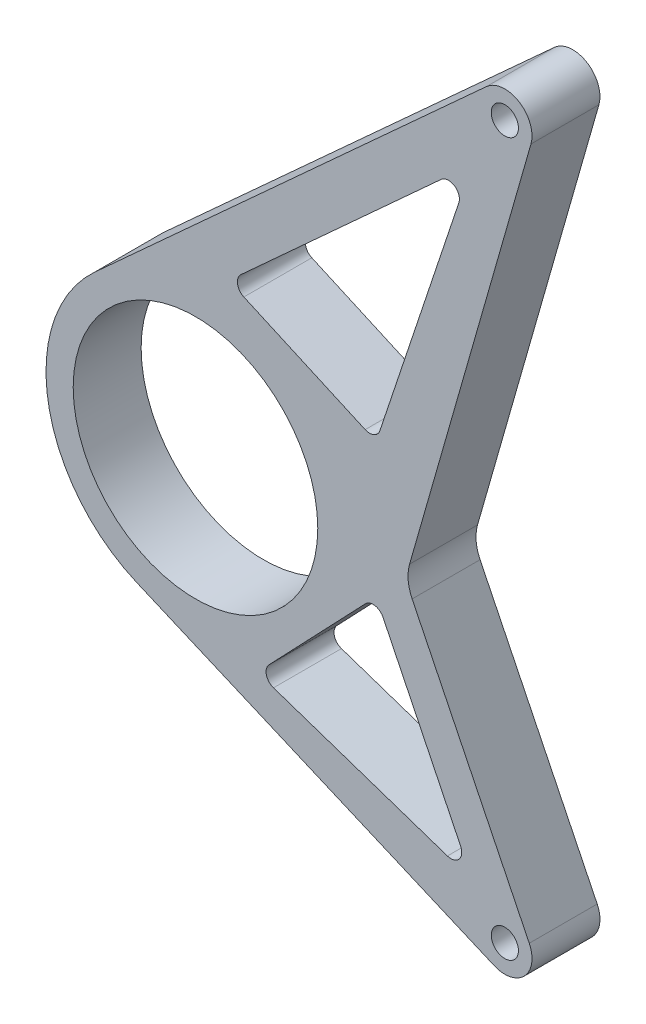
ISO-10303-21;
HEADER;
FILE_DESCRIPTION(('STEP AP214'),'2;1');
FILE_NAME('part.step','',(''),(''),'','','');
FILE_SCHEMA(('AUTOMOTIVE_DESIGN { 1 0 10303 214 1 1 1 1 }'));
ENDSEC;
DATA;
#1=APPLICATION_CONTEXT('core data for automotive mechanical design processes');
#2=APPLICATION_PROTOCOL_DEFINITION('international standard','automotive_design',2000,#1);
#3=PRODUCT_CONTEXT('',#1,'mechanical');
#4=PRODUCT('Part','Part','',(#3));
#5=PRODUCT_RELATED_PRODUCT_CATEGORY('part','',(#4));
#6=PRODUCT_DEFINITION_FORMATION('','',#4);
#7=PRODUCT_DEFINITION_CONTEXT('part definition',#1,'design');
#8=PRODUCT_DEFINITION('design','',#6,#7);
#9=PRODUCT_DEFINITION_SHAPE('','',#8);
#10=(LENGTH_UNIT() NAMED_UNIT(*) SI_UNIT(.MILLI.,.METRE.));
#11=(NAMED_UNIT(*) PLANE_ANGLE_UNIT() SI_UNIT($,.RADIAN.));
#12=(NAMED_UNIT(*) SI_UNIT($,.STERADIAN.) SOLID_ANGLE_UNIT());
#13=UNCERTAINTY_MEASURE_WITH_UNIT(LENGTH_MEASURE(1.E-05),#10,'distance_accuracy_value','');
#14=(GEOMETRIC_REPRESENTATION_CONTEXT(3) GLOBAL_UNCERTAINTY_ASSIGNED_CONTEXT((#13)) GLOBAL_UNIT_ASSIGNED_CONTEXT((#10,
#11,#12)) REPRESENTATION_CONTEXT('',''));
#15=CARTESIAN_POINT('',(0.,0.,0.));
#16=DIRECTION('',(0.,0.,1.));
#17=DIRECTION('',(1.,0.,0.));
#18=AXIS2_PLACEMENT_3D('',#15,#16,#17);
#19=CARTESIAN_POINT('',(62.322121242482,30.4626489139366,25.));
#20=DIRECTION('',(-0.89841816686152,-0.439140976741167,0.));
#21=DIRECTION('',(0.439140976741167,-0.89841816686152,0.));
#22=AXIS2_PLACEMENT_3D('',#19,#20,#21);
#23=PLANE('',#22);
#24=DIRECTION('',(-0.439140976741167,0.89841816686152,0.));
#25=VECTOR('',#24,1.);
#26=CARTESIAN_POINT('',(62.322121242482,30.4626489139366,0.));
#27=LINE('',#26,#25);
#28=CARTESIAN_POINT('',(122.814256533455,-93.2954064170916,0.));
#29=VERTEX_POINT('',#28);
#30=CARTESIAN_POINT('',(79.7177248539004,-5.12621009894399,0.));
#31=VERTEX_POINT('',#30);
#32=EDGE_CURVE('E349',#29,#31,#27,.T.);
#33=ORIENTED_EDGE('',*,*,#32,.T.);
#34=DIRECTION('',(0.,0.,-1.));
#35=VECTOR('',#34,1.);
#36=CARTESIAN_POINT('',(79.7177248539004,-5.12621009894399,25.));
#37=LINE('',#36,#35);
#38=CARTESIAN_POINT('',(79.7177248539004,-5.12621009894399,25.));
#39=VERTEX_POINT('',#38);
#40=EDGE_CURVE('E11',#39,#31,#37,.T.);
#41=ORIENTED_EDGE('',*,*,#40,.F.);
#42=DIRECTION('',(-0.439140976741167,0.89841816686152,0.));
#43=VECTOR('',#42,1.);
#44=CARTESIAN_POINT('',(62.322121242482,30.4626489139366,25.));
#45=LINE('',#44,#43);
#46=CARTESIAN_POINT('',(122.814256533455,-93.2954064170916,25.));
#47=VERTEX_POINT('',#46);
#48=EDGE_CURVE('E311',#47,#39,#45,.T.);
#49=ORIENTED_EDGE('',*,*,#48,.F.);
#50=DIRECTION('',(0.,0.,-1.));
#51=VECTOR('',#50,1.);
#52=CARTESIAN_POINT('',(122.814256533455,-93.2954064170916,25.));
#53=LINE('',#52,#51);
#54=EDGE_CURVE('E337',#47,#29,#53,.T.);
#55=ORIENTED_EDGE('',*,*,#54,.T.);
#56=EDGE_LOOP('',(#33,#41,#49,#55));
#57=FACE_BOUND('',#56,.T.);
#58=ADVANCED_FACE('F41',(#57),#23,.F.);
#59=CARTESIAN_POINT('',(93.0700707771078,1.40033004325586,25.));
#60=DIRECTION('',(0.,0.,-1.));
#61=DIRECTION('',(-1.,0.,0.));
#62=AXIS2_PLACEMENT_3D('',#59,#60,#61);
#63=CYLINDRICAL_SURFACE('',#62,14.862061360415);
#64=CARTESIAN_POINT('',(93.0700707771078,1.40033004325586,0.));
#65=DIRECTION('',(0.,0.,1.));
#66=DIRECTION('',(1.,0.,0.));
#67=AXIS2_PLACEMENT_3D('',#64,#65,#66);
#68=CIRCLE('',#67,14.862061360415);
#69=CARTESIAN_POINT('',(78.7806227117508,5.48598077088858,0.));
#70=VERTEX_POINT('',#69);
#71=EDGE_CURVE('E353',#31,#70,#68,.F.);
#72=ORIENTED_EDGE('',*,*,#71,.T.);
#73=DIRECTION('',(0.,0.,-1.));
#74=VECTOR('',#73,1.);
#75=CARTESIAN_POINT('',(78.7806227117508,5.48598077088858,25.));
#76=LINE('',#75,#74);
#77=CARTESIAN_POINT('',(78.7806227117508,5.48598077088858,25.));
#78=VERTEX_POINT('',#77);
#79=EDGE_CURVE('E50',#78,#70,#76,.T.);
#80=ORIENTED_EDGE('',*,*,#79,.F.);
#81=CARTESIAN_POINT('',(93.0700707771078,1.40033004325586,25.));
#82=DIRECTION('',(0.,0.,1.));
#83=DIRECTION('',(1.,0.,0.));
#84=AXIS2_PLACEMENT_3D('',#81,#82,#83);
#85=CIRCLE('',#84,14.862061360415);
#86=EDGE_CURVE('E315',#39,#78,#85,.F.);
#87=ORIENTED_EDGE('',*,*,#86,.F.);
#88=ORIENTED_EDGE('',*,*,#40,.T.);
#89=EDGE_LOOP('',(#72,#80,#87,#88));
#90=FACE_BOUND('',#89,.T.);
#91=ADVANCED_FACE('F418',(#90),#63,.F.);
#92=CARTESIAN_POINT('',(71.3769498235631,-20.4081561197483,25.));
#93=DIRECTION('',(-0.9614714755126,0.274904713993092,0.));
#94=DIRECTION('',(-0.274904713993092,-0.9614714755126,0.));
#95=AXIS2_PLACEMENT_3D('',#92,#93,#94);
#96=PLANE('',#95);
#97=DIRECTION('',(0.274904713993092,0.9614714755126,0.));
#98=VECTOR('',#97,1.);
#99=CARTESIAN_POINT('',(71.3769498235631,-20.4081561197483,0.));
#100=LINE('',#99,#98);
#101=CARTESIAN_POINT('',(123.444789619966,161.69764348127,0.));
#102=VERTEX_POINT('',#101);
#103=EDGE_CURVE('E356',#70,#102,#100,.T.);
#104=ORIENTED_EDGE('',*,*,#103,.T.);
#105=DIRECTION('',(0.,0.,-1.));
#106=VECTOR('',#105,1.);
#107=CARTESIAN_POINT('',(123.444789619966,161.69764348127,25.));
#108=LINE('',#107,#106);
#109=CARTESIAN_POINT('',(123.444789619966,161.69764348127,25.));
#110=VERTEX_POINT('',#109);
#111=EDGE_CURVE('E392',#110,#102,#108,.T.);
#112=ORIENTED_EDGE('',*,*,#111,.F.);
#113=DIRECTION('',(0.274904713993092,0.9614714755126,0.));
#114=VECTOR('',#113,1.);
#115=CARTESIAN_POINT('',(71.3769498235631,-20.4081561197483,25.));
#116=LINE('',#115,#114);
#117=EDGE_CURVE('E318',#78,#110,#116,.T.);
#118=ORIENTED_EDGE('',*,*,#117,.F.);
#119=ORIENTED_EDGE('',*,*,#79,.T.);
#120=EDGE_LOOP('',(#104,#112,#118,#119));
#121=FACE_BOUND('',#120,.T.);
#122=ADVANCED_FACE('F401',(#121),#96,.F.);
#123=CARTESIAN_POINT('',(113.83007486484,164.446690621201,25.));
#124=DIRECTION('',(0.,0.,-1.));
#125=DIRECTION('',(-1.,0.,0.));
#126=AXIS2_PLACEMENT_3D('',#123,#124,#125);
#127=CYLINDRICAL_SURFACE('',#126,10.);
#128=CARTESIAN_POINT('',(113.83007486484,164.446690621201,0.));
#129=DIRECTION('',(0.,0.,1.));
#130=DIRECTION('',(1.,0.,0.));
#131=AXIS2_PLACEMENT_3D('',#128,#129,#130);
#132=CIRCLE('',#131,10.);
#133=CARTESIAN_POINT('',(107.099159500341,171.842282440383,0.));
#134=VERTEX_POINT('',#133);
#135=EDGE_CURVE('E359',#102,#134,#132,.T.);
#136=ORIENTED_EDGE('',*,*,#135,.T.);
#137=DIRECTION('',(0.,0.,-1.));
#138=VECTOR('',#137,1.);
#139=CARTESIAN_POINT('',(107.099159500341,171.842282440383,25.));
#140=LINE('',#139,#138);
#141=CARTESIAN_POINT('',(107.099159500341,171.842282440383,25.));
#142=VERTEX_POINT('',#141);
#143=EDGE_CURVE('E389',#142,#134,#140,.T.);
#144=ORIENTED_EDGE('',*,*,#143,.F.);
#145=CARTESIAN_POINT('',(113.83007486484,164.446690621201,25.));
#146=DIRECTION('',(0.,0.,1.));
#147=DIRECTION('',(1.,0.,0.));
#148=AXIS2_PLACEMENT_3D('',#145,#146,#147);
#149=CIRCLE('',#148,10.);
#150=EDGE_CURVE('E321',#110,#142,#149,.T.);
#151=ORIENTED_EDGE('',*,*,#150,.F.);
#152=ORIENTED_EDGE('',*,*,#111,.T.);
#153=EDGE_LOOP('',(#136,#144,#151,#152));
#154=FACE_BOUND('',#153,.T.);
#155=ADVANCED_FACE('F412',(#154),#127,.T.);
#156=CARTESIAN_POINT('',(-37.020034504742,40.6757550055031,25.));
#157=DIRECTION('',(-0.673091536449854,0.739559181918239,0.));
#158=DIRECTION('',(-0.739559181918239,-0.673091536449854,0.));
#159=AXIS2_PLACEMENT_3D('',#156,#157,#158);
#160=PLANE('',#159);
#161=DIRECTION('',(0.739559181918239,0.673091536449854,0.));
#162=VECTOR('',#161,1.);
#163=CARTESIAN_POINT('',(-37.020034504742,40.6757550055031,0.));
#164=LINE('',#163,#162);
#165=CARTESIAN_POINT('',(-37.020034504742,40.6757550055031,0.));
#166=VERTEX_POINT('',#165);
#167=EDGE_CURVE('E363',#166,#134,#164,.T.);
#168=ORIENTED_EDGE('',*,*,#167,.F.);
#169=DIRECTION('',(0.,0.,-1.));
#170=VECTOR('',#169,1.);
#171=CARTESIAN_POINT('',(-37.020034504742,40.6757550055031,25.));
#172=LINE('',#171,#170);
#173=CARTESIAN_POINT('',(-37.020034504742,40.6757550055031,25.));
#174=VERTEX_POINT('',#173);
#175=EDGE_CURVE('E386',#174,#166,#172,.T.);
#176=ORIENTED_EDGE('',*,*,#175,.F.);
#177=DIRECTION('',(0.739559181918239,0.673091536449854,0.));
#178=VECTOR('',#177,1.);
#179=CARTESIAN_POINT('',(-37.020034504742,40.6757550055031,25.));
#180=LINE('',#179,#178);
#181=EDGE_CURVE('E324',#174,#142,#180,.T.);
#182=ORIENTED_EDGE('',*,*,#181,.T.);
#183=ORIENTED_EDGE('',*,*,#143,.T.);
#184=EDGE_LOOP('',(#168,#176,#182,#183));
#185=FACE_BOUND('',#184,.T.);
#186=ADVANCED_FACE('F435',(#185),#160,.T.);
#187=CARTESIAN_POINT('',(0.,0.,25.));
#188=DIRECTION('',(0.,0.,-1.));
#189=DIRECTION('',(-1.,0.,0.));
#190=AXIS2_PLACEMENT_3D('',#187,#188,#189);
#191=CYLINDRICAL_SURFACE('',#190,55.);
#192=CARTESIAN_POINT('',(0.,0.,0.));
#193=DIRECTION('',(0.,0.,1.));
#194=DIRECTION('',(1.,0.,0.));
#195=AXIS2_PLACEMENT_3D('',#192,#193,#194);
#196=CIRCLE('',#195,55.);
#197=CARTESIAN_POINT('',(-21.6473623522042,-50.5607723753541,0.));
#198=VERTEX_POINT('',#197);
#199=EDGE_CURVE('E367',#166,#198,#196,.T.);
#200=ORIENTED_EDGE('',*,*,#199,.T.);
#201=DIRECTION('',(0.,0.,-1.));
#202=VECTOR('',#201,1.);
#203=CARTESIAN_POINT('',(-21.6473623522042,-50.5607723753541,25.));
#204=LINE('',#203,#202);
#205=CARTESIAN_POINT('',(-21.6473623522042,-50.5607723753541,25.));
#206=VERTEX_POINT('',#205);
#207=EDGE_CURVE('E382',#206,#198,#204,.T.);
#208=ORIENTED_EDGE('',*,*,#207,.F.);
#209=CARTESIAN_POINT('',(0.,0.,25.));
#210=DIRECTION('',(0.,0.,1.));
#211=DIRECTION('',(1.,0.,0.));
#212=AXIS2_PLACEMENT_3D('',#209,#210,#211);
#213=CIRCLE('',#212,55.);
#214=EDGE_CURVE('E328',#174,#206,#213,.T.);
#215=ORIENTED_EDGE('',*,*,#214,.F.);
#216=ORIENTED_EDGE('',*,*,#175,.T.);
#217=EDGE_LOOP('',(#200,#208,#215,#216));
#218=FACE_BOUND('',#217,.T.);
#219=ADVANCED_FACE('F433',(#218),#191,.T.);
#220=CARTESIAN_POINT('',(-21.6473623522042,-50.5607723753541,25.));
#221=DIRECTION('',(0.393588406403713,0.919286770460984,0.));
#222=DIRECTION('',(-0.919286770460984,0.393588406403713,0.));
#223=AXIS2_PLACEMENT_3D('',#220,#221,#222);
#224=PLANE('',#223);
#225=DIRECTION('',(0.919286770460984,-0.393588406403713,0.));
#226=VECTOR('',#225,1.);
#227=CARTESIAN_POINT('',(-21.6473623522042,-50.5607723753541,0.));
#228=LINE('',#227,#226);
#229=CARTESIAN_POINT('',(109.894190800803,-106.879683889113,0.));
#230=VERTEX_POINT('',#229);
#231=EDGE_CURVE('E370',#198,#230,#228,.T.);
#232=ORIENTED_EDGE('',*,*,#231,.T.);
#233=DIRECTION('',(0.,0.,-1.));
#234=VECTOR('',#233,1.);
#235=CARTESIAN_POINT('',(109.894190800803,-106.879683889113,25.));
#236=LINE('',#235,#234);
#237=CARTESIAN_POINT('',(109.894190800803,-106.879683889113,25.));
#238=VERTEX_POINT('',#237);
#239=EDGE_CURVE('E378',#238,#230,#236,.T.);
#240=ORIENTED_EDGE('',*,*,#239,.F.);
#241=DIRECTION('',(0.919286770460984,-0.393588406403713,0.));
#242=VECTOR('',#241,1.);
#243=CARTESIAN_POINT('',(-21.6473623522042,-50.5607723753541,25.));
#244=LINE('',#243,#242);
#245=EDGE_CURVE('E331',#206,#238,#244,.T.);
#246=ORIENTED_EDGE('',*,*,#245,.F.);
#247=ORIENTED_EDGE('',*,*,#207,.T.);
#248=EDGE_LOOP('',(#232,#240,#246,#247));
#249=FACE_BOUND('',#248,.T.);
#250=ADVANCED_FACE('F429',(#249),#224,.F.);
#251=CARTESIAN_POINT('',(113.83007486484,-97.6868161845032,25.));
#252=DIRECTION('',(0.,0.,-1.));
#253=DIRECTION('',(-1.,0.,0.));
#254=AXIS2_PLACEMENT_3D('',#251,#252,#253);
#255=CYLINDRICAL_SURFACE('',#254,4.99999999999999);
#256=CARTESIAN_POINT('',(113.83007486484,-97.6868161845032,25.));
#257=DIRECTION('',(0.,0.,1.));
#258=DIRECTION('',(1.,0.,0.));
#259=AXIS2_PLACEMENT_3D('',#256,#257,#258);
#260=CIRCLE('',#259,4.99999999999999);
#261=CARTESIAN_POINT('',(118.83007486484,-97.6868161845032,25.));
#262=VERTEX_POINT('',#261);
#263=EDGE_CURVE('E307',#262,#262,#260,.T.);
#264=ORIENTED_EDGE('',*,*,#263,.T.);
#265=EDGE_LOOP('',(#264));
#266=FACE_BOUND('',#265,.T.);
#267=CARTESIAN_POINT('',(113.83007486484,-97.6868161845032,0.));
#268=DIRECTION('',(0.,0.,1.));
#269=DIRECTION('',(1.,0.,0.));
#270=AXIS2_PLACEMENT_3D('',#267,#268,#269);
#271=CIRCLE('',#270,4.99999999999999);
#272=CARTESIAN_POINT('',(118.83007486484,-97.6868161845032,0.));
#273=VERTEX_POINT('',#272);
#274=EDGE_CURVE('E345',#273,#273,#271,.T.);
#275=ORIENTED_EDGE('',*,*,#274,.F.);
#276=EDGE_LOOP('',(#275));
#277=FACE_BOUND('',#276,.T.);
#278=ADVANCED_FACE('F452',(#266,#277),#255,.F.);
#279=CARTESIAN_POINT('',(113.83007486484,164.446690621201,25.));
#280=DIRECTION('',(0.,0.,-1.));
#281=DIRECTION('',(-1.,0.,0.));
#282=AXIS2_PLACEMENT_3D('',#279,#280,#281);
#283=CYLINDRICAL_SURFACE('',#282,4.99999999999999);
#284=CARTESIAN_POINT('',(113.83007486484,164.446690621201,25.));
#285=DIRECTION('',(0.,0.,1.));
#286=DIRECTION('',(1.,0.,0.));
#287=AXIS2_PLACEMENT_3D('',#284,#285,#286);
#288=CIRCLE('',#287,4.99999999999999);
#289=CARTESIAN_POINT('',(118.83007486484,164.446690621201,25.));
#290=VERTEX_POINT('',#289);
#291=EDGE_CURVE('E302',#290,#290,#288,.T.);
#292=ORIENTED_EDGE('',*,*,#291,.T.);
#293=EDGE_LOOP('',(#292));
#294=FACE_BOUND('',#293,.T.);
#295=CARTESIAN_POINT('',(113.83007486484,164.446690621201,0.));
#296=DIRECTION('',(0.,0.,1.));
#297=DIRECTION('',(1.,0.,0.));
#298=AXIS2_PLACEMENT_3D('',#295,#296,#297);
#299=CIRCLE('',#298,4.99999999999999);
#300=CARTESIAN_POINT('',(118.83007486484,164.446690621201,0.));
#301=VERTEX_POINT('',#300);
#302=EDGE_CURVE('E341',#301,#301,#299,.T.);
#303=ORIENTED_EDGE('',*,*,#302,.F.);
#304=EDGE_LOOP('',(#303));
#305=FACE_BOUND('',#304,.T.);
#306=ADVANCED_FACE('F454',(#294,#305),#283,.F.);
#307=CARTESIAN_POINT('',(0.,0.,25.));
#308=DIRECTION('',(0.,0.,-1.));
#309=DIRECTION('',(-1.,0.,0.));
#310=AXIS2_PLACEMENT_3D('',#307,#308,#309);
#311=CYLINDRICAL_SURFACE('',#310,45.);
#312=CARTESIAN_POINT('',(0.,0.,25.));
#313=DIRECTION('',(0.,0.,1.));
#314=DIRECTION('',(1.,0.,0.));
#315=AXIS2_PLACEMENT_3D('',#312,#313,#314);
#316=CIRCLE('',#315,45.);
#317=CARTESIAN_POINT('',(45.,0.,25.));
#318=VERTEX_POINT('',#317);
#319=EDGE_CURVE('E298',#318,#318,#316,.T.);
#320=ORIENTED_EDGE('',*,*,#319,.T.);
#321=EDGE_LOOP('',(#320));
#322=FACE_BOUND('',#321,.T.);
#323=CARTESIAN_POINT('',(0.,0.,0.));
#324=DIRECTION('',(0.,0.,1.));
#325=DIRECTION('',(1.,0.,0.));
#326=AXIS2_PLACEMENT_3D('',#323,#324,#325);
#327=CIRCLE('',#326,45.);
#328=CARTESIAN_POINT('',(45.,0.,0.));
#329=VERTEX_POINT('',#328);
#330=EDGE_CURVE('E237',#329,#329,#327,.T.);
#331=ORIENTED_EDGE('',*,*,#330,.F.);
#332=EDGE_LOOP('',(#331));
#333=FACE_BOUND('',#332,.T.);
#334=ADVANCED_FACE('F43',(#322,#333),#311,.F.);
#335=CARTESIAN_POINT('',(113.83007486484,-97.6868161845032,25.));
#336=DIRECTION('',(0.,0.,-1.));
#337=DIRECTION('',(-1.,0.,0.));
#338=AXIS2_PLACEMENT_3D('',#335,#336,#337);
#339=CYLINDRICAL_SURFACE('',#338,9.99999999999999);
#340=CARTESIAN_POINT('',(113.83007486484,-97.6868161845032,0.));
#341=DIRECTION('',(0.,0.,1.));
#342=DIRECTION('',(1.,0.,0.));
#343=AXIS2_PLACEMENT_3D('',#340,#341,#342);
#344=CIRCLE('',#343,9.99999999999999);
#345=EDGE_CURVE('E303',#230,#29,#344,.T.);
#346=ORIENTED_EDGE('',*,*,#345,.T.);
#347=ORIENTED_EDGE('',*,*,#54,.F.);
#348=CARTESIAN_POINT('',(113.83007486484,-97.6868161845032,25.));
#349=DIRECTION('',(0.,0.,1.));
#350=DIRECTION('',(1.,0.,0.));
#351=AXIS2_PLACEMENT_3D('',#348,#349,#350);
#352=CIRCLE('',#351,9.99999999999999);
#353=EDGE_CURVE('E334',#238,#47,#352,.T.);
#354=ORIENTED_EDGE('',*,*,#353,.F.);
#355=ORIENTED_EDGE('',*,*,#239,.T.);
#356=EDGE_LOOP('',(#346,#347,#354,#355));
#357=FACE_BOUND('',#356,.T.);
#358=ADVANCED_FACE('F424',(#357),#339,.T.);
#359=CARTESIAN_POINT('',(0.,0.,25.));
#360=DIRECTION('',(0.,0.,1.));
#361=DIRECTION('',(1.,0.,0.));
#362=AXIS2_PLACEMENT_3D('',#359,#360,#361);
#363=PLANE('',#362);
#364=CARTESIAN_POINT('',(29.9800730188524,-55.167689470348,25.));
#365=DIRECTION('',(0.,0.,1.));
#366=DIRECTION('',(1.,0.,0.));
#367=AXIS2_PLACEMENT_3D('',#364,#365,#366);
#368=CIRCLE('',#367,4.);
#369=CARTESIAN_POINT('',(27.0858957131333,-52.4065777878802,25.));
#370=VERTEX_POINT('',#369);
#371=CARTESIAN_POINT('',(28.7013880644725,-58.9578035566839,25.));
#372=VERTEX_POINT('',#371);
#373=EDGE_CURVE('E57',#370,#372,#368,.T.);
#374=ORIENTED_EDGE('',*,*,#373,.F.);
#375=DIRECTION('',(-0.690277920616938,-0.723544326429802,0.));
#376=VECTOR('',#375,1.);
#377=CARTESIAN_POINT('',(27.0858957131333,-52.4065777878802,25.));
#378=LINE('',#377,#376);
#379=CARTESIAN_POINT('',(62.4963093675046,-15.2896381742621,25.));
#380=VERTEX_POINT('',#379);
#381=EDGE_CURVE('E217',#380,#370,#378,.T.);
#382=ORIENTED_EDGE('',*,*,#381,.F.);
#383=CARTESIAN_POINT('',(65.3904866732238,-18.0507498567298,25.));
#384=DIRECTION('',(0.,0.,1.));
#385=DIRECTION('',(1.,0.,0.));
#386=AXIS2_PLACEMENT_3D('',#383,#384,#385);
#387=CIRCLE('',#386,4.);
#388=CARTESIAN_POINT('',(68.9868458298607,-16.2996927998428,25.));
#389=VERTEX_POINT('',#388);
#390=EDGE_CURVE('E210',#389,#380,#387,.T.);
#391=ORIENTED_EDGE('',*,*,#390,.F.);
#392=DIRECTION('',(-0.437764264221767,0.899089789159222,0.));
#393=VECTOR('',#392,1.);
#394=CARTESIAN_POINT('',(68.9868458298607,-16.2996927998428,25.));
#395=LINE('',#394,#393);
#396=CARTESIAN_POINT('',(97.5711556472447,-75.0067714433257,25.));
#397=VERTEX_POINT('',#396);
#398=EDGE_CURVE('E206',#397,#389,#395,.T.);
#399=ORIENTED_EDGE('',*,*,#398,.F.);
#400=CARTESIAN_POINT('',(93.9747964906079,-76.7578285002128,25.));
#401=DIRECTION('',(0.,0.,1.));
#402=DIRECTION('',(1.,0.,0.));
#403=AXIS2_PLACEMENT_3D('',#400,#401,#402);
#404=CIRCLE('',#403,4.);
#405=CARTESIAN_POINT('',(92.6961115362278,-80.5479425865488,25.));
#406=VERTEX_POINT('',#405);
#407=EDGE_CURVE('E186',#406,#397,#404,.T.);
#408=ORIENTED_EDGE('',*,*,#407,.F.);
#409=DIRECTION('',(0.947528521583988,-0.319671238595,0.));
#410=VECTOR('',#409,1.);
#411=CARTESIAN_POINT('',(92.6961115362278,-80.5479425865488,25.));
#412=LINE('',#411,#410);
#413=EDGE_CURVE('E197',#372,#406,#412,.T.);
#414=ORIENTED_EDGE('',*,*,#413,.F.);
#415=EDGE_LOOP('',(#374,#382,#391,#399,#408,#414));
#416=FACE_BOUND('',#415,.T.);
#417=CARTESIAN_POINT('',(64.0690551579823,43.8364563127413,25.));
#418=DIRECTION('',(0.,0.,1.));
#419=DIRECTION('',(1.,0.,0.));
#420=AXIS2_PLACEMENT_3D('',#417,#418,#419);
#421=CIRCLE('',#420,4.);
#422=CARTESIAN_POINT('',(62.4379238355675,40.1841405255951,25.));
#423=VERTEX_POINT('',#422);
#424=CARTESIAN_POINT('',(67.8637883501844,42.571545248674,25.));
#425=VERTEX_POINT('',#424);
#426=EDGE_CURVE('E65',#423,#425,#421,.T.);
#427=ORIENTED_EDGE('',*,*,#426,.F.);
#428=DIRECTION('',(0.913078946786549,-0.407782830603701,0.));
#429=VECTOR('',#428,1.);
#430=CARTESIAN_POINT('',(17.795721204545,60.1214349044983,25.));
#431=LINE('',#430,#429);
#432=CARTESIAN_POINT('',(17.795721204545,60.1214349044983,25.));
#433=VERTEX_POINT('',#432);
#434=EDGE_CURVE('E275',#433,#423,#431,.T.);
#435=ORIENTED_EDGE('',*,*,#434,.F.);
#436=CARTESIAN_POINT('',(19.4268525269598,63.7737506916445,25.));
#437=DIRECTION('',(0.,0.,1.));
#438=DIRECTION('',(1.,0.,0.));
#439=AXIS2_PLACEMENT_3D('',#436,#437,#438);
#440=CIRCLE('',#439,4.);
#441=CARTESIAN_POINT('',(16.7318370962171,66.7295740672979,25.));
#442=VERTEX_POINT('',#441);
#443=EDGE_CURVE('E271',#442,#433,#440,.T.);
#444=ORIENTED_EDGE('',*,*,#443,.F.);
#445=DIRECTION('',(-0.73895584391333,-0.673753857685683,0.));
#446=VECTOR('',#445,1.);
#447=CARTESIAN_POINT('',(90.413142409555,133.909587735341,25.));
#448=LINE('',#447,#446);
#449=CARTESIAN_POINT('',(90.413142409555,133.909587735341,25.));
#450=VERTEX_POINT('',#449);
#451=EDGE_CURVE('E267',#450,#442,#448,.T.);
#452=ORIENTED_EDGE('',*,*,#451,.F.);
#453=CARTESIAN_POINT('',(93.1081578402979,130.953764359688,25.));
#454=DIRECTION('',(0.,0.,1.));
#455=DIRECTION('',(-1.,0.,0.));
#456=AXIS2_PLACEMENT_3D('',#453,#454,#455);
#457=CIRCLE('',#456,4.);
#458=CARTESIAN_POINT('',(96.9028910324999,129.688853295621,25.));
#459=VERTEX_POINT('',#458);
#460=EDGE_CURVE('E263',#459,#450,#457,.T.);
#461=ORIENTED_EDGE('',*,*,#460,.F.);
#462=DIRECTION('',(0.316227766016838,0.948683298050514,0.));
#463=VECTOR('',#462,1.);
#464=CARTESIAN_POINT('',(67.8637883501844,42.571545248674,25.));
#465=LINE('',#464,#463);
#466=EDGE_CURVE('E259',#425,#459,#465,.T.);
#467=ORIENTED_EDGE('',*,*,#466,.F.);
#468=EDGE_LOOP('',(#427,#435,#444,#452,#461,#467));
#469=FACE_BOUND('',#468,.T.);
#470=ORIENTED_EDGE('',*,*,#319,.F.);
#471=EDGE_LOOP('',(#470));
#472=FACE_BOUND('',#471,.T.);
#473=ORIENTED_EDGE('',*,*,#291,.F.);
#474=EDGE_LOOP('',(#473));
#475=FACE_BOUND('',#474,.T.);
#476=ORIENTED_EDGE('',*,*,#263,.F.);
#477=EDGE_LOOP('',(#476));
#478=FACE_BOUND('',#477,.T.);
#479=ORIENTED_EDGE('',*,*,#48,.T.);
#480=ORIENTED_EDGE('',*,*,#86,.T.);
#481=ORIENTED_EDGE('',*,*,#117,.T.);
#482=ORIENTED_EDGE('',*,*,#150,.T.);
#483=ORIENTED_EDGE('',*,*,#181,.F.);
#484=ORIENTED_EDGE('',*,*,#214,.T.);
#485=ORIENTED_EDGE('',*,*,#245,.T.);
#486=ORIENTED_EDGE('',*,*,#353,.T.);
#487=EDGE_LOOP('',(#479,#480,#481,#482,#483,#484,#485,#486));
#488=FACE_BOUND('',#487,.T.);
#489=ADVANCED_FACE('F202',(#416,#469,#472,#475,#478,#488),#363,.T.);
#490=CARTESIAN_POINT('',(0.,0.,0.));
#491=DIRECTION('',(0.,0.,1.));
#492=DIRECTION('',(1.,0.,0.));
#493=AXIS2_PLACEMENT_3D('',#490,#491,#492);
#494=PLANE('',#493);
#495=DIRECTION('',(0.690277920616938,0.723544326429802,0.));
#496=VECTOR('',#495,1.);
#497=CARTESIAN_POINT('',(27.0858957131333,-52.4065777878802,0.));
#498=LINE('',#497,#496);
#499=CARTESIAN_POINT('',(27.0858957131333,-52.4065777878802,0.));
#500=VERTEX_POINT('',#499);
#501=CARTESIAN_POINT('',(62.4963093675046,-15.2896381742621,0.));
#502=VERTEX_POINT('',#501);
#503=EDGE_CURVE('E647',#500,#502,#498,.T.);
#504=ORIENTED_EDGE('',*,*,#503,.F.);
#505=CARTESIAN_POINT('',(29.9800730188524,-55.167689470348,0.));
#506=DIRECTION('',(0.,0.,1.));
#507=DIRECTION('',(1.,0.,0.));
#508=AXIS2_PLACEMENT_3D('',#505,#506,#507);
#509=CIRCLE('',#508,4.);
#510=CARTESIAN_POINT('',(28.7013880644725,-58.9578035566839,0.));
#511=VERTEX_POINT('',#510);
#512=EDGE_CURVE('E238',#511,#500,#509,.F.);
#513=ORIENTED_EDGE('',*,*,#512,.F.);
#514=DIRECTION('',(-0.947528521583988,0.319671238595,0.));
#515=VECTOR('',#514,1.);
#516=CARTESIAN_POINT('',(92.6961115362278,-80.5479425865488,0.));
#517=LINE('',#516,#515);
#518=CARTESIAN_POINT('',(92.6961115362278,-80.5479425865487,0.));
#519=VERTEX_POINT('',#518);
#520=EDGE_CURVE('E234',#519,#511,#517,.T.);
#521=ORIENTED_EDGE('',*,*,#520,.F.);
#522=CARTESIAN_POINT('',(93.9747964906079,-76.7578285002128,0.));
#523=DIRECTION('',(0.,0.,1.));
#524=DIRECTION('',(1.,0.,0.));
#525=AXIS2_PLACEMENT_3D('',#522,#523,#524);
#526=CIRCLE('',#525,4.);
#527=CARTESIAN_POINT('',(97.5711556472447,-75.0067714433257,0.));
#528=VERTEX_POINT('',#527);
#529=EDGE_CURVE('E189',#528,#519,#526,.F.);
#530=ORIENTED_EDGE('',*,*,#529,.F.);
#531=DIRECTION('',(0.437764264221767,-0.899089789159223,0.));
#532=VECTOR('',#531,1.);
#533=CARTESIAN_POINT('',(68.9868458298607,-16.2996927998428,0.));
#534=LINE('',#533,#532);
#535=CARTESIAN_POINT('',(68.9868458298607,-16.2996927998428,0.));
#536=VERTEX_POINT('',#535);
#537=EDGE_CURVE('E636',#536,#528,#534,.T.);
#538=ORIENTED_EDGE('',*,*,#537,.F.);
#539=CARTESIAN_POINT('',(65.3904866732238,-18.0507498567298,0.));
#540=DIRECTION('',(0.,0.,1.));
#541=DIRECTION('',(1.,0.,0.));
#542=AXIS2_PLACEMENT_3D('',#539,#540,#541);
#543=CIRCLE('',#542,4.);
#544=EDGE_CURVE('E639',#502,#536,#543,.F.);
#545=ORIENTED_EDGE('',*,*,#544,.F.);
#546=EDGE_LOOP('',(#504,#513,#521,#530,#538,#545));
#547=FACE_BOUND('',#546,.T.);
#548=DIRECTION('',(-0.913078946786549,0.407782830603701,0.));
#549=VECTOR('',#548,1.);
#550=CARTESIAN_POINT('',(17.795721204545,60.1214349044983,0.));
#551=LINE('',#550,#549);
#552=CARTESIAN_POINT('',(62.4379238355675,40.1841405255951,0.));
#553=VERTEX_POINT('',#552);
#554=CARTESIAN_POINT('',(17.795721204545,60.1214349044983,0.));
#555=VERTEX_POINT('',#554);
#556=EDGE_CURVE('E250',#553,#555,#551,.T.);
#557=ORIENTED_EDGE('',*,*,#556,.F.);
#558=CARTESIAN_POINT('',(64.0690551579823,43.8364563127413,0.));
#559=DIRECTION('',(0.,0.,1.));
#560=DIRECTION('',(1.,0.,0.));
#561=AXIS2_PLACEMENT_3D('',#558,#559,#560);
#562=CIRCLE('',#561,4.);
#563=CARTESIAN_POINT('',(67.8637883501844,42.571545248674,0.));
#564=VERTEX_POINT('',#563);
#565=EDGE_CURVE('E253',#564,#553,#562,.F.);
#566=ORIENTED_EDGE('',*,*,#565,.F.);
#567=DIRECTION('',(-0.316227766016838,-0.948683298050514,0.));
#568=VECTOR('',#567,1.);
#569=CARTESIAN_POINT('',(67.8637883501844,42.571545248674,0.));
#570=LINE('',#569,#568);
#571=CARTESIAN_POINT('',(96.9028910324999,129.688853295621,0.));
#572=VERTEX_POINT('',#571);
#573=EDGE_CURVE('E256',#572,#564,#570,.T.);
#574=ORIENTED_EDGE('',*,*,#573,.F.);
#575=CARTESIAN_POINT('',(93.1081578402979,130.953764359688,0.));
#576=DIRECTION('',(0.,0.,1.));
#577=DIRECTION('',(1.,0.,0.));
#578=AXIS2_PLACEMENT_3D('',#575,#576,#577);
#579=CIRCLE('',#578,4.);
#580=CARTESIAN_POINT('',(90.413142409555,133.909587735341,0.));
#581=VERTEX_POINT('',#580);
#582=EDGE_CURVE('E239',#581,#572,#579,.F.);
#583=ORIENTED_EDGE('',*,*,#582,.F.);
#584=DIRECTION('',(0.73895584391333,0.673753857685683,0.));
#585=VECTOR('',#584,1.);
#586=CARTESIAN_POINT('',(90.413142409555,133.909587735341,0.));
#587=LINE('',#586,#585);
#588=CARTESIAN_POINT('',(16.7318370962171,66.7295740672979,0.));
#589=VERTEX_POINT('',#588);
#590=EDGE_CURVE('E243',#589,#581,#587,.T.);
#591=ORIENTED_EDGE('',*,*,#590,.F.);
#592=CARTESIAN_POINT('',(19.4268525269598,63.7737506916445,0.));
#593=DIRECTION('',(0.,0.,1.));
#594=DIRECTION('',(1.,0.,0.));
#595=AXIS2_PLACEMENT_3D('',#592,#593,#594);
#596=CIRCLE('',#595,4.);
#597=EDGE_CURVE('E247',#555,#589,#596,.F.);
#598=ORIENTED_EDGE('',*,*,#597,.F.);
#599=EDGE_LOOP('',(#557,#566,#574,#583,#591,#598));
#600=FACE_BOUND('',#599,.T.);
#601=ORIENTED_EDGE('',*,*,#330,.T.);
#602=EDGE_LOOP('',(#601));
#603=FACE_BOUND('',#602,.T.);
#604=ORIENTED_EDGE('',*,*,#302,.T.);
#605=EDGE_LOOP('',(#604));
#606=FACE_BOUND('',#605,.T.);
#607=ORIENTED_EDGE('',*,*,#274,.T.);
#608=EDGE_LOOP('',(#607));
#609=FACE_BOUND('',#608,.T.);
#610=ORIENTED_EDGE('',*,*,#32,.F.);
#611=ORIENTED_EDGE('',*,*,#345,.F.);
#612=ORIENTED_EDGE('',*,*,#231,.F.);
#613=ORIENTED_EDGE('',*,*,#199,.F.);
#614=ORIENTED_EDGE('',*,*,#167,.T.);
#615=ORIENTED_EDGE('',*,*,#135,.F.);
#616=ORIENTED_EDGE('',*,*,#103,.F.);
#617=ORIENTED_EDGE('',*,*,#71,.F.);
#618=EDGE_LOOP('',(#610,#611,#612,#613,#614,#615,#616,#617));
#619=FACE_BOUND('',#618,.T.);
#620=ADVANCED_FACE('F407',(#547,#600,#603,#606,#609,#619),#494,.F.);
#621=CARTESIAN_POINT('',(64.0690551579823,43.8364563127413,-125.375986248518));
#622=DIRECTION('',(0.,0.,1.));
#623=DIRECTION('',(1.,0.,0.));
#624=AXIS2_PLACEMENT_3D('',#621,#622,#623);
#625=CYLINDRICAL_SURFACE('',#624,4.);
#626=ORIENTED_EDGE('',*,*,#565,.T.);
#627=DIRECTION('',(0.,0.,1.));
#628=VECTOR('',#627,1.);
#629=CARTESIAN_POINT('',(62.4379238355675,40.1841405255951,-125.375986248518));
#630=LINE('',#629,#628);
#631=EDGE_CURVE('E244',#553,#423,#630,.T.);
#632=ORIENTED_EDGE('',*,*,#631,.T.);
#633=ORIENTED_EDGE('',*,*,#426,.T.);
#634=DIRECTION('',(0.,0.,1.));
#635=VECTOR('',#634,1.);
#636=CARTESIAN_POINT('',(67.8637883501844,42.571545248674,-125.375986248518));
#637=LINE('',#636,#635);
#638=EDGE_CURVE('E279',#564,#425,#637,.T.);
#639=ORIENTED_EDGE('',*,*,#638,.F.);
#640=EDGE_LOOP('',(#626,#632,#633,#639));
#641=FACE_BOUND('',#640,.T.);
#642=ADVANCED_FACE('F468',(#641),#625,.F.);
#643=CARTESIAN_POINT('',(17.795721204545,60.1214349044983,-125.375986248518));
#644=DIRECTION('',(-0.407782830603701,-0.913078946786549,0.));
#645=DIRECTION('',(0.913078946786549,-0.407782830603701,0.));
#646=AXIS2_PLACEMENT_3D('',#643,#644,#645);
#647=PLANE('',#646);
#648=ORIENTED_EDGE('',*,*,#556,.T.);
#649=DIRECTION('',(0.,0.,1.));
#650=VECTOR('',#649,1.);
#651=CARTESIAN_POINT('',(17.795721204545,60.1214349044983,-125.375986248518));
#652=LINE('',#651,#650);
#653=EDGE_CURVE('E282',#555,#433,#652,.T.);
#654=ORIENTED_EDGE('',*,*,#653,.T.);
#655=ORIENTED_EDGE('',*,*,#434,.T.);
#656=ORIENTED_EDGE('',*,*,#631,.F.);
#657=EDGE_LOOP('',(#648,#654,#655,#656));
#658=FACE_BOUND('',#657,.T.);
#659=ADVANCED_FACE('F477',(#658),#647,.F.);
#660=CARTESIAN_POINT('',(19.4268525269598,63.7737506916445,-125.375986248518));
#661=DIRECTION('',(0.,0.,1.));
#662=DIRECTION('',(1.,0.,0.));
#663=AXIS2_PLACEMENT_3D('',#660,#661,#662);
#664=CYLINDRICAL_SURFACE('',#663,4.);
#665=ORIENTED_EDGE('',*,*,#597,.T.);
#666=DIRECTION('',(0.,0.,1.));
#667=VECTOR('',#666,1.);
#668=CARTESIAN_POINT('',(16.7318370962171,66.7295740672979,-125.375986248518));
#669=LINE('',#668,#667);
#670=EDGE_CURVE('E285',#589,#442,#669,.T.);
#671=ORIENTED_EDGE('',*,*,#670,.T.);
#672=ORIENTED_EDGE('',*,*,#443,.T.);
#673=ORIENTED_EDGE('',*,*,#653,.F.);
#674=EDGE_LOOP('',(#665,#671,#672,#673));
#675=FACE_BOUND('',#674,.T.);
#676=ADVANCED_FACE('F535',(#675),#664,.F.);
#677=CARTESIAN_POINT('',(90.413142409555,133.909587735341,-125.375986248518));
#678=DIRECTION('',(-0.673753857685683,0.738955843913329,0.));
#679=DIRECTION('',(-0.73895584391333,-0.673753857685683,0.));
#680=AXIS2_PLACEMENT_3D('',#677,#678,#679);
#681=PLANE('',#680);
#682=ORIENTED_EDGE('',*,*,#590,.T.);
#683=DIRECTION('',(0.,0.,1.));
#684=VECTOR('',#683,1.);
#685=CARTESIAN_POINT('',(90.413142409555,133.909587735341,-125.375986248518));
#686=LINE('',#685,#684);
#687=EDGE_CURVE('E288',#581,#450,#686,.T.);
#688=ORIENTED_EDGE('',*,*,#687,.T.);
#689=ORIENTED_EDGE('',*,*,#451,.T.);
#690=ORIENTED_EDGE('',*,*,#670,.F.);
#691=EDGE_LOOP('',(#682,#688,#689,#690));
#692=FACE_BOUND('',#691,.T.);
#693=ADVANCED_FACE('F545',(#692),#681,.F.);
#694=CARTESIAN_POINT('',(93.1081578402979,130.953764359688,-125.375986248518));
#695=DIRECTION('',(0.,0.,1.));
#696=DIRECTION('',(1.,0.,0.));
#697=AXIS2_PLACEMENT_3D('',#694,#695,#696);
#698=CYLINDRICAL_SURFACE('',#697,4.);
#699=ORIENTED_EDGE('',*,*,#582,.T.);
#700=DIRECTION('',(0.,0.,1.));
#701=VECTOR('',#700,1.);
#702=CARTESIAN_POINT('',(96.9028910324999,129.688853295621,-125.375986248518));
#703=LINE('',#702,#701);
#704=EDGE_CURVE('E291',#572,#459,#703,.T.);
#705=ORIENTED_EDGE('',*,*,#704,.T.);
#706=ORIENTED_EDGE('',*,*,#460,.T.);
#707=ORIENTED_EDGE('',*,*,#687,.F.);
#708=EDGE_LOOP('',(#699,#705,#706,#707));
#709=FACE_BOUND('',#708,.T.);
#710=ADVANCED_FACE('F555',(#709),#698,.F.);
#711=CARTESIAN_POINT('',(67.8637883501844,42.571545248674,-125.375986248518));
#712=DIRECTION('',(0.948683298050514,-0.316227766016838,0.));
#713=DIRECTION('',(0.316227766016838,0.948683298050514,0.));
#714=AXIS2_PLACEMENT_3D('',#711,#712,#713);
#715=PLANE('',#714);
#716=ORIENTED_EDGE('',*,*,#573,.T.);
#717=ORIENTED_EDGE('',*,*,#638,.T.);
#718=ORIENTED_EDGE('',*,*,#466,.T.);
#719=ORIENTED_EDGE('',*,*,#704,.F.);
#720=EDGE_LOOP('',(#716,#717,#718,#719));
#721=FACE_BOUND('',#720,.T.);
#722=ADVANCED_FACE('F565',(#721),#715,.F.);
#723=CARTESIAN_POINT('',(29.9800730188524,-55.167689470348,-125.375986248518));
#724=DIRECTION('',(0.,0.,1.));
#725=DIRECTION('',(1.,0.,0.));
#726=AXIS2_PLACEMENT_3D('',#723,#724,#725);
#727=CYLINDRICAL_SURFACE('',#726,4.);
#728=ORIENTED_EDGE('',*,*,#512,.T.);
#729=DIRECTION('',(0.,0.,1.));
#730=VECTOR('',#729,1.);
#731=CARTESIAN_POINT('',(27.0858957131333,-52.4065777878802,-125.375986248518));
#732=LINE('',#731,#730);
#733=EDGE_CURVE('E221',#500,#370,#732,.T.);
#734=ORIENTED_EDGE('',*,*,#733,.T.);
#735=ORIENTED_EDGE('',*,*,#373,.T.);
#736=DIRECTION('',(0.,0.,1.));
#737=VECTOR('',#736,1.);
#738=CARTESIAN_POINT('',(28.7013880644725,-58.957803556684,-125.375986248518));
#739=LINE('',#738,#737);
#740=EDGE_CURVE('E194',#511,#372,#739,.T.);
#741=ORIENTED_EDGE('',*,*,#740,.F.);
#742=EDGE_LOOP('',(#728,#734,#735,#741));
#743=FACE_BOUND('',#742,.T.);
#744=ADVANCED_FACE('F575',(#743),#727,.F.);
#745=CARTESIAN_POINT('',(27.0858957131333,-52.4065777878802,-125.375986248518));
#746=DIRECTION('',(-0.723544326429802,0.690277920616938,0.));
#747=DIRECTION('',(-0.690277920616938,-0.723544326429802,0.));
#748=AXIS2_PLACEMENT_3D('',#745,#746,#747);
#749=PLANE('',#748);
#750=ORIENTED_EDGE('',*,*,#503,.T.);
#751=DIRECTION('',(0.,0.,1.));
#752=VECTOR('',#751,1.);
#753=CARTESIAN_POINT('',(62.4963093675046,-15.2896381742621,-125.375986248518));
#754=LINE('',#753,#752);
#755=EDGE_CURVE('E224',#502,#380,#754,.T.);
#756=ORIENTED_EDGE('',*,*,#755,.T.);
#757=ORIENTED_EDGE('',*,*,#381,.T.);
#758=ORIENTED_EDGE('',*,*,#733,.F.);
#759=EDGE_LOOP('',(#750,#756,#757,#758));
#760=FACE_BOUND('',#759,.T.);
#761=ADVANCED_FACE('F585',(#760),#749,.F.);
#762=CARTESIAN_POINT('',(65.3904866732238,-18.0507498567298,-125.375986248518));
#763=DIRECTION('',(0.,0.,1.));
#764=DIRECTION('',(1.,0.,0.));
#765=AXIS2_PLACEMENT_3D('',#762,#763,#764);
#766=CYLINDRICAL_SURFACE('',#765,4.);
#767=ORIENTED_EDGE('',*,*,#544,.T.);
#768=DIRECTION('',(0.,0.,1.));
#769=VECTOR('',#768,1.);
#770=CARTESIAN_POINT('',(68.9868458298607,-16.2996927998428,-125.375986248518));
#771=LINE('',#770,#769);
#772=EDGE_CURVE('E227',#536,#389,#771,.T.);
#773=ORIENTED_EDGE('',*,*,#772,.T.);
#774=ORIENTED_EDGE('',*,*,#390,.T.);
#775=ORIENTED_EDGE('',*,*,#755,.F.);
#776=EDGE_LOOP('',(#767,#773,#774,#775));
#777=FACE_BOUND('',#776,.T.);
#778=ADVANCED_FACE('F594',(#777),#766,.F.);
#779=CARTESIAN_POINT('',(68.9868458298607,-16.2996927998428,-125.375986248518));
#780=DIRECTION('',(0.899089789159222,0.437764264221767,0.));
#781=DIRECTION('',(-0.437764264221767,0.899089789159223,0.));
#782=AXIS2_PLACEMENT_3D('',#779,#780,#781);
#783=PLANE('',#782);
#784=ORIENTED_EDGE('',*,*,#537,.T.);
#785=DIRECTION('',(0.,0.,1.));
#786=VECTOR('',#785,1.);
#787=CARTESIAN_POINT('',(97.5711556472447,-75.0067714433257,-125.375986248518));
#788=LINE('',#787,#786);
#789=EDGE_CURVE('E193',#528,#397,#788,.T.);
#790=ORIENTED_EDGE('',*,*,#789,.T.);
#791=ORIENTED_EDGE('',*,*,#398,.T.);
#792=ORIENTED_EDGE('',*,*,#772,.F.);
#793=EDGE_LOOP('',(#784,#790,#791,#792));
#794=FACE_BOUND('',#793,.T.);
#795=ADVANCED_FACE('F604',(#794),#783,.F.);
#796=CARTESIAN_POINT('',(93.9747964906079,-76.7578285002128,-125.375986248518));
#797=DIRECTION('',(0.,0.,1.));
#798=DIRECTION('',(1.,0.,0.));
#799=AXIS2_PLACEMENT_3D('',#796,#797,#798);
#800=CYLINDRICAL_SURFACE('',#799,4.);
#801=ORIENTED_EDGE('',*,*,#529,.T.);
#802=DIRECTION('',(0.,0.,1.));
#803=VECTOR('',#802,1.);
#804=CARTESIAN_POINT('',(92.6961115362278,-80.5479425865488,-125.375986248518));
#805=LINE('',#804,#803);
#806=EDGE_CURVE('E181',#519,#406,#805,.T.);
#807=ORIENTED_EDGE('',*,*,#806,.T.);
#808=ORIENTED_EDGE('',*,*,#407,.T.);
#809=ORIENTED_EDGE('',*,*,#789,.F.);
#810=EDGE_LOOP('',(#801,#807,#808,#809));
#811=FACE_BOUND('',#810,.T.);
#812=ADVANCED_FACE('F183',(#811),#800,.F.);
#813=CARTESIAN_POINT('',(92.6961115362278,-80.5479425865488,-125.375986248518));
#814=DIRECTION('',(-0.319671238595,-0.947528521583988,0.));
#815=DIRECTION('',(0.947528521583988,-0.319671238595,0.));
#816=AXIS2_PLACEMENT_3D('',#813,#814,#815);
#817=PLANE('',#816);
#818=ORIENTED_EDGE('',*,*,#520,.T.);
#819=ORIENTED_EDGE('',*,*,#740,.T.);
#820=ORIENTED_EDGE('',*,*,#413,.T.);
#821=ORIENTED_EDGE('',*,*,#806,.F.);
#822=EDGE_LOOP('',(#818,#819,#820,#821));
#823=FACE_BOUND('',#822,.T.);
#824=ADVANCED_FACE('F198',(#823),#817,.F.);
#825=CLOSED_SHELL('',(#58,#91,#122,#155,#186,#219,#250,#278,#306,#334,#358,#489,#620,#642,#659,
#676,#693,#710,#722,#744,#761,#778,#795,#812,#824));
#826=MANIFOLD_SOLID_BREP('B2',#825);
#827=ADVANCED_BREP_SHAPE_REPRESENTATION('',(#18,#826),#14);
#828=SHAPE_DEFINITION_REPRESENTATION(#9,#827);
ENDSEC;
END-ISO-10303-21;
